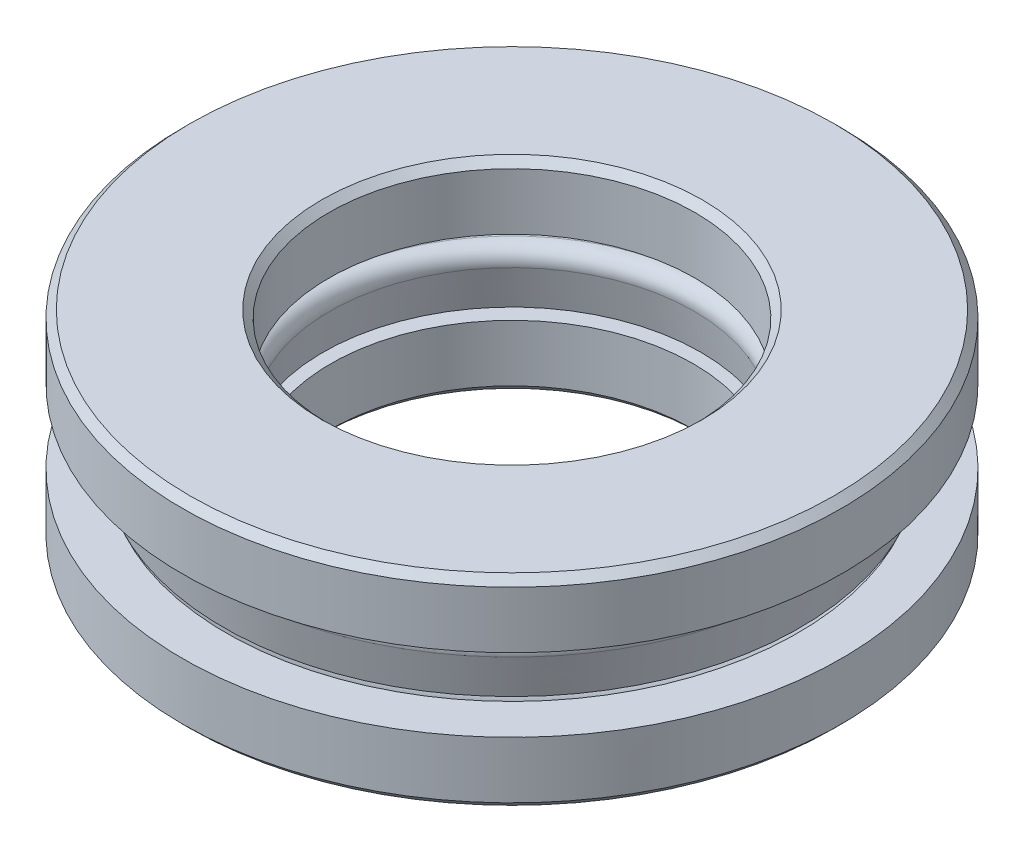
ISO-10303-21;
HEADER;
FILE_DESCRIPTION(('STEP AP214'),'2;1');
FILE_NAME('part.step','',(''),(''),'','','');
FILE_SCHEMA(('AUTOMOTIVE_DESIGN { 1 0 10303 214 1 1 1 1 }'));
ENDSEC;
DATA;
#1=APPLICATION_CONTEXT('core data for automotive mechanical design processes');
#2=APPLICATION_PROTOCOL_DEFINITION('international standard','automotive_design',2000,#1);
#3=PRODUCT_CONTEXT('',#1,'mechanical');
#4=PRODUCT('Part','Part','',(#3));
#5=PRODUCT_RELATED_PRODUCT_CATEGORY('part','',(#4));
#6=PRODUCT_DEFINITION_FORMATION('','',#4);
#7=PRODUCT_DEFINITION_CONTEXT('part definition',#1,'design');
#8=PRODUCT_DEFINITION('design','',#6,#7);
#9=PRODUCT_DEFINITION_SHAPE('','',#8);
#10=(LENGTH_UNIT() NAMED_UNIT(*) SI_UNIT(.MILLI.,.METRE.));
#11=(NAMED_UNIT(*) PLANE_ANGLE_UNIT() SI_UNIT($,.RADIAN.));
#12=(NAMED_UNIT(*) SI_UNIT($,.STERADIAN.) SOLID_ANGLE_UNIT());
#13=UNCERTAINTY_MEASURE_WITH_UNIT(LENGTH_MEASURE(1.E-05),#10,'distance_accuracy_value','');
#14=(GEOMETRIC_REPRESENTATION_CONTEXT(3) GLOBAL_UNCERTAINTY_ASSIGNED_CONTEXT((#13)) GLOBAL_UNIT_ASSIGNED_CONTEXT((#10,
#11,#12)) REPRESENTATION_CONTEXT('',''));
#15=CARTESIAN_POINT('',(0.,0.,0.));
#16=DIRECTION('',(0.,0.,1.));
#17=DIRECTION('',(1.,0.,0.));
#18=AXIS2_PLACEMENT_3D('',#15,#16,#17);
#19=CARTESIAN_POINT('',(0.,-0.834729635533447,0.));
#20=DIRECTION('',(0.,-1.,0.));
#21=DIRECTION('',(0.,0.,-1.));
#22=AXIS2_PLACEMENT_3D('',#19,#20,#21);
#23=CONICAL_SURFACE('',#22,7.87064602924939,1.39626340159545);
#24=CARTESIAN_POINT('',(0.,-0.800000000000058,0.));
#25=DIRECTION('',(0.,-1.,0.));
#26=DIRECTION('',(0.,0.,-1.));
#27=AXIS2_PLACEMENT_3D('',#24,#25,#26);
#28=CIRCLE('',#27,7.67368447864695);
#29=CARTESIAN_POINT('',(0.,-0.80000000000012,-7.67368447864692));
#30=VERTEX_POINT('',#29);
#31=EDGE_CURVE('E84',#30,#30,#28,.T.);
#32=ORIENTED_EDGE('',*,*,#31,.F.);
#33=EDGE_LOOP('',(#32));
#34=FACE_BOUND('',#33,.T.);
#35=CARTESIAN_POINT('',(0.,-0.834729635533447,0.));
#36=DIRECTION('',(0.,-1.,0.));
#37=DIRECTION('',(0.,0.,-1.));
#38=AXIS2_PLACEMENT_3D('',#35,#36,#37);
#39=CIRCLE('',#38,7.87064602924939);
#40=CARTESIAN_POINT('',(0.,-0.83472963553351,-7.87064602924936));
#41=VERTEX_POINT('',#40);
#42=EDGE_CURVE('E11',#41,#41,#39,.T.);
#43=ORIENTED_EDGE('',*,*,#42,.T.);
#44=EDGE_LOOP('',(#43));
#45=FACE_BOUND('',#44,.T.);
#46=ADVANCED_FACE('F44',(#34,#45),#23,.F.);
#47=CARTESIAN_POINT('',(0.,0.230540728933161,0.));
#48=DIRECTION('',(0.,1.,0.));
#49=DIRECTION('',(0.,0.,1.));
#50=AXIS2_PLACEMENT_3D('',#47,#48,#49);
#51=CONICAL_SURFACE('',#50,8.05848193625401,0.174532925199447);
#52=ORIENTED_EDGE('',*,*,#42,.F.);
#53=EDGE_LOOP('',(#52));
#54=FACE_BOUND('',#53,.T.);
#55=CARTESIAN_POINT('',(0.,0.230540728933161,0.));
#56=DIRECTION('',(0.,-1.,0.));
#57=DIRECTION('',(0.,0.,-1.));
#58=AXIS2_PLACEMENT_3D('',#55,#56,#57);
#59=CIRCLE('',#58,8.05848193625401);
#60=CARTESIAN_POINT('',(0.,0.230540728933097,-8.05848193625399));
#61=VERTEX_POINT('',#60);
#62=EDGE_CURVE('E50',#61,#61,#59,.T.);
#63=ORIENTED_EDGE('',*,*,#62,.T.);
#64=EDGE_LOOP('',(#63));
#65=FACE_BOUND('',#64,.T.);
#66=ADVANCED_FACE('F91',(#54,#65),#51,.T.);
#67=CARTESIAN_POINT('',(0.,0.299999999999938,0.));
#68=DIRECTION('',(0.,-1.,0.));
#69=DIRECTION('',(0.,0.,-1.));
#70=AXIS2_PLACEMENT_3D('',#67,#68,#69);
#71=TOROIDAL_SURFACE('',#70,7.66455883504913,0.4);
#72=ORIENTED_EDGE('',*,*,#62,.F.);
#73=EDGE_LOOP('',(#72));
#74=FACE_BOUND('',#73,.T.);
#75=CARTESIAN_POINT('',(0.,0.699999999999938,0.));
#76=DIRECTION('',(0.,-1.,0.));
#77=DIRECTION('',(0.,0.,-1.));
#78=AXIS2_PLACEMENT_3D('',#75,#76,#77);
#79=CIRCLE('',#78,7.66455883504913);
#80=CARTESIAN_POINT('',(0.,0.699999999999877,-7.66455883504911));
#81=VERTEX_POINT('',#80);
#82=EDGE_CURVE('E54',#81,#81,#79,.T.);
#83=ORIENTED_EDGE('',*,*,#82,.T.);
#84=EDGE_LOOP('',(#83));
#85=FACE_BOUND('',#84,.T.);
#86=ADVANCED_FACE('F95',(#74,#85),#71,.T.);
#87=CARTESIAN_POINT('',(0.,0.700000000000008,7.66455883504915));
#88=DIRECTION('',(0.,-1.,0.));
#89=DIRECTION('',(0.,0.,-1.));
#90=AXIS2_PLACEMENT_3D('',#87,#88,#89);
#91=PLANE('',#90);
#92=ORIENTED_EDGE('',*,*,#82,.F.);
#93=EDGE_LOOP('',(#92));
#94=FACE_BOUND('',#93,.T.);
#95=CARTESIAN_POINT('',(0.,0.699999999999957,0.));
#96=DIRECTION('',(0.,-1.,0.));
#97=DIRECTION('',(0.,0.,-1.));
#98=AXIS2_PLACEMENT_3D('',#95,#96,#97);
#99=CIRCLE('',#98,5.36544116495084);
#100=CARTESIAN_POINT('',(0.,0.699999999999914,-5.36544116495082));
#101=VERTEX_POINT('',#100);
#102=EDGE_CURVE('E58',#101,#101,#99,.T.);
#103=ORIENTED_EDGE('',*,*,#102,.T.);
#104=EDGE_LOOP('',(#103));
#105=FACE_BOUND('',#104,.T.);
#106=ADVANCED_FACE('F100',(#94,#105),#91,.F.);
#107=CARTESIAN_POINT('',(0.,0.299999999999957,0.));
#108=DIRECTION('',(0.,-1.,0.));
#109=DIRECTION('',(0.,0.,-1.));
#110=AXIS2_PLACEMENT_3D('',#107,#108,#109);
#111=TOROIDAL_SURFACE('',#110,5.36544116495083,0.4);
#112=ORIENTED_EDGE('',*,*,#102,.F.);
#113=EDGE_LOOP('',(#112));
#114=FACE_BOUND('',#113,.T.);
#115=CARTESIAN_POINT('',(0.,0.230540728933186,0.));
#116=DIRECTION('',(0.,-1.,0.));
#117=DIRECTION('',(0.,0.,-1.));
#118=AXIS2_PLACEMENT_3D('',#115,#116,#117);
#119=CIRCLE('',#118,4.97151806374595);
#120=CARTESIAN_POINT('',(0.,0.230540728933146,-4.97151806374593));
#121=VERTEX_POINT('',#120);
#122=EDGE_CURVE('E63',#121,#121,#119,.T.);
#123=ORIENTED_EDGE('',*,*,#122,.T.);
#124=EDGE_LOOP('',(#123));
#125=FACE_BOUND('',#124,.T.);
#126=ADVANCED_FACE('F106',(#114,#125),#111,.T.);
#127=CARTESIAN_POINT('',(0.,-0.834729635533425,0.));
#128=DIRECTION('',(0.,-1.,0.));
#129=DIRECTION('',(0.,0.,-1.));
#130=AXIS2_PLACEMENT_3D('',#127,#128,#129);
#131=CONICAL_SURFACE('',#130,5.15935397075055,0.17453292519943);
#132=ORIENTED_EDGE('',*,*,#122,.F.);
#133=EDGE_LOOP('',(#132));
#134=FACE_BOUND('',#133,.T.);
#135=CARTESIAN_POINT('',(0.,-0.834729635533425,0.));
#136=DIRECTION('',(0.,-1.,0.));
#137=DIRECTION('',(0.,0.,-1.));
#138=AXIS2_PLACEMENT_3D('',#135,#136,#137);
#139=CIRCLE('',#138,5.15935397075055);
#140=CARTESIAN_POINT('',(0.,-0.834729635533466,-5.15935397075052));
#141=VERTEX_POINT('',#140);
#142=EDGE_CURVE('E66',#141,#141,#139,.T.);
#143=ORIENTED_EDGE('',*,*,#142,.T.);
#144=EDGE_LOOP('',(#143));
#145=FACE_BOUND('',#144,.T.);
#146=ADVANCED_FACE('F110',(#134,#145),#131,.F.);
#147=CARTESIAN_POINT('',(0.,-0.80000000000004,0.));
#148=DIRECTION('',(0.,1.,0.));
#149=DIRECTION('',(0.,0.,1.));
#150=AXIS2_PLACEMENT_3D('',#147,#148,#149);
#151=CONICAL_SURFACE('',#150,5.35631552135299,1.39626340159547);
#152=ORIENTED_EDGE('',*,*,#142,.F.);
#153=EDGE_LOOP('',(#152));
#154=FACE_BOUND('',#153,.T.);
#155=CARTESIAN_POINT('',(0.,-0.80000000000004,0.));
#156=DIRECTION('',(0.,-1.,0.));
#157=DIRECTION('',(0.,0.,-1.));
#158=AXIS2_PLACEMENT_3D('',#155,#156,#157);
#159=CIRCLE('',#158,5.35631552135299);
#160=CARTESIAN_POINT('',(0.,-0.800000000000082,-5.35631552135296));
#161=VERTEX_POINT('',#160);
#162=EDGE_CURVE('E69',#161,#161,#159,.T.);
#163=ORIENTED_EDGE('',*,*,#162,.T.);
#164=EDGE_LOOP('',(#163));
#165=FACE_BOUND('',#164,.T.);
#166=ADVANCED_FACE('F114',(#154,#165),#151,.T.);
#167=CARTESIAN_POINT('',(0.,0.265270364466571,0.));
#168=DIRECTION('',(0.,-1.,0.));
#169=DIRECTION('',(0.,0.,-1.));
#170=AXIS2_PLACEMENT_3D('',#167,#168,#169);
#171=CONICAL_SURFACE('',#170,5.16847961434839,0.174532925199428);
#172=ORIENTED_EDGE('',*,*,#162,.F.);
#173=EDGE_LOOP('',(#172));
#174=FACE_BOUND('',#173,.T.);
#175=CARTESIAN_POINT('',(0.,0.265270364466571,0.));
#176=DIRECTION('',(0.,-1.,0.));
#177=DIRECTION('',(0.,0.,-1.));
#178=AXIS2_PLACEMENT_3D('',#175,#176,#177);
#179=CIRCLE('',#178,5.16847961434839);
#180=CARTESIAN_POINT('',(0.,0.26527036446653,-5.16847961434837));
#181=VERTEX_POINT('',#180);
#182=EDGE_CURVE('E72',#181,#181,#179,.T.);
#183=ORIENTED_EDGE('',*,*,#182,.T.);
#184=EDGE_LOOP('',(#183));
#185=FACE_BOUND('',#184,.T.);
#186=ADVANCED_FACE('F118',(#174,#185),#171,.T.);
#187=CARTESIAN_POINT('',(0.,0.299999999999957,0.));
#188=DIRECTION('',(0.,-1.,0.));
#189=DIRECTION('',(0.,0.,-1.));
#190=AXIS2_PLACEMENT_3D('',#187,#188,#189);
#191=TOROIDAL_SURFACE('',#190,5.36544116495083,0.2);
#192=ORIENTED_EDGE('',*,*,#182,.F.);
#193=EDGE_LOOP('',(#192));
#194=FACE_BOUND('',#193,.T.);
#195=CARTESIAN_POINT('',(0.,0.499999999999957,0.));
#196=DIRECTION('',(0.,-1.,0.));
#197=DIRECTION('',(0.,0.,-1.));
#198=AXIS2_PLACEMENT_3D('',#195,#196,#197);
#199=CIRCLE('',#198,5.36544116495083);
#200=CARTESIAN_POINT('',(0.,0.499999999999914,-5.36544116495081));
#201=VERTEX_POINT('',#200);
#202=EDGE_CURVE('E75',#201,#201,#199,.T.);
#203=ORIENTED_EDGE('',*,*,#202,.T.);
#204=EDGE_LOOP('',(#203));
#205=FACE_BOUND('',#204,.T.);
#206=ADVANCED_FACE('F122',(#194,#205),#191,.F.);
#207=CARTESIAN_POINT('',(0.,0.49999999999999,5.36544116495085));
#208=DIRECTION('',(0.,1.,0.));
#209=DIRECTION('',(0.,0.,1.));
#210=AXIS2_PLACEMENT_3D('',#207,#208,#209);
#211=PLANE('',#210);
#212=ORIENTED_EDGE('',*,*,#202,.F.);
#213=EDGE_LOOP('',(#212));
#214=FACE_BOUND('',#213,.T.);
#215=CARTESIAN_POINT('',(0.,0.499999999999937,0.));
#216=DIRECTION('',(0.,-1.,0.));
#217=DIRECTION('',(0.,0.,-1.));
#218=AXIS2_PLACEMENT_3D('',#215,#216,#217);
#219=CIRCLE('',#218,7.66455883504913);
#220=CARTESIAN_POINT('',(0.,0.499999999999876,-7.66455883504911));
#221=VERTEX_POINT('',#220);
#222=EDGE_CURVE('E78',#221,#221,#219,.T.);
#223=ORIENTED_EDGE('',*,*,#222,.T.);
#224=EDGE_LOOP('',(#223));
#225=FACE_BOUND('',#224,.T.);
#226=ADVANCED_FACE('F126',(#214,#225),#211,.F.);
#227=CARTESIAN_POINT('',(0.,0.299999999999938,0.));
#228=DIRECTION('',(0.,-1.,0.));
#229=DIRECTION('',(0.,0.,-1.));
#230=AXIS2_PLACEMENT_3D('',#227,#228,#229);
#231=TOROIDAL_SURFACE('',#230,7.66455883504913,0.199999999999999);
#232=ORIENTED_EDGE('',*,*,#222,.F.);
#233=EDGE_LOOP('',(#232));
#234=FACE_BOUND('',#233,.T.);
#235=CARTESIAN_POINT('',(0.,0.26527036446655,0.));
#236=DIRECTION('',(0.,-1.,0.));
#237=DIRECTION('',(0.,0.,-1.));
#238=AXIS2_PLACEMENT_3D('',#235,#236,#237);
#239=CIRCLE('',#238,7.86152038565157);
#240=CARTESIAN_POINT('',(0.,0.265270364466487,-7.86152038565155));
#241=VERTEX_POINT('',#240);
#242=EDGE_CURVE('E81',#241,#241,#239,.T.);
#243=ORIENTED_EDGE('',*,*,#242,.T.);
#244=EDGE_LOOP('',(#243));
#245=FACE_BOUND('',#244,.T.);
#246=ADVANCED_FACE('F130',(#234,#245),#231,.F.);
#247=CARTESIAN_POINT('',(0.,-0.800000000000058,0.));
#248=DIRECTION('',(0.,1.,0.));
#249=DIRECTION('',(0.,0.,1.));
#250=AXIS2_PLACEMENT_3D('',#247,#248,#249);
#251=CONICAL_SURFACE('',#250,7.67368447864695,0.174532925199444);
#252=ORIENTED_EDGE('',*,*,#242,.F.);
#253=EDGE_LOOP('',(#252));
#254=FACE_BOUND('',#253,.T.);
#255=ORIENTED_EDGE('',*,*,#31,.T.);
#256=EDGE_LOOP('',(#255));
#257=FACE_BOUND('',#256,.T.);
#258=ADVANCED_FACE('F88',(#254,#257),#251,.F.);
#259=CLOSED_SHELL('',(#46,#66,#86,#106,#126,#146,#166,#186,#206,#226,#246,#258));
#260=MANIFOLD_SOLID_BREP('B2',#259);
#261=CARTESIAN_POINT('',(-4.6068006794303,0.,-4.60680067943041));
#262=DIRECTION('',(-0.707106781186539,0.,-0.707106781186556));
#263=DIRECTION('',(0.707106781186556,0.,-0.707106781186539));
#264=AXIS2_PLACEMENT_3D('',#261,#262,#263);
#265=SPHERICAL_SURFACE('',#264,1.28);
#266=CARTESIAN_POINT('',(-5.51189735934907,0.,-5.5118973593492));
#267=VERTEX_POINT('',#266);
#268=VERTEX_LOOP('',#267);
#269=FACE_BOUND('',#268,.T.);
#270=ADVANCED_FACE('F232',(#269),#265,.T.);
#271=CLOSED_SHELL('',(#270));
#272=MANIFOLD_SOLID_BREP('B6',#271);
#273=CARTESIAN_POINT('',(-6.515,0.,0.));
#274=DIRECTION('',(-1.,0.,0.));
#275=DIRECTION('',(0.,0.,-1.));
#276=AXIS2_PLACEMENT_3D('',#273,#274,#275);
#277=SPHERICAL_SURFACE('',#276,1.28);
#278=CARTESIAN_POINT('',(-7.795,0.,0.));
#279=VERTEX_POINT('',#278);
#280=VERTEX_LOOP('',#279);
#281=FACE_BOUND('',#280,.T.);
#282=ADVANCED_FACE('F253',(#281),#277,.T.);
#283=CLOSED_SHELL('',(#282));
#284=MANIFOLD_SOLID_BREP('B40',#283);
#285=CARTESIAN_POINT('',(-4.6068006794304,0.,4.60680067943032));
#286=DIRECTION('',(-0.707106781186554,0.,0.707106781186541));
#287=DIRECTION('',(-0.707106781186541,0.,-0.707106781186554));
#288=AXIS2_PLACEMENT_3D('',#285,#286,#287);
#289=SPHERICAL_SURFACE('',#288,1.28);
#290=CARTESIAN_POINT('',(-5.51189735934919,0.,5.51189735934909));
#291=VERTEX_POINT('',#290);
#292=VERTEX_LOOP('',#291);
#293=FACE_BOUND('',#292,.T.);
#294=ADVANCED_FACE('F274',(#293),#289,.T.);
#295=CLOSED_SHELL('',(#294));
#296=MANIFOLD_SOLID_BREP('B228',#295);
#297=CARTESIAN_POINT('',(0.,0.,6.515));
#298=DIRECTION('',(0.,0.,1.));
#299=DIRECTION('',(-1.,0.,0.));
#300=AXIS2_PLACEMENT_3D('',#297,#298,#299);
#301=SPHERICAL_SURFACE('',#300,1.28);
#302=CARTESIAN_POINT('',(0.,0.,7.795));
#303=VERTEX_POINT('',#302);
#304=VERTEX_LOOP('',#303);
#305=FACE_BOUND('',#304,.T.);
#306=ADVANCED_FACE('F295',(#305),#301,.T.);
#307=CLOSED_SHELL('',(#306));
#308=MANIFOLD_SOLID_BREP('B249',#307);
#309=CARTESIAN_POINT('',(4.60680067943033,0.,4.60680067943038));
#310=DIRECTION('',(0.707106781186544,0.,0.707106781186551));
#311=DIRECTION('',(-0.707106781186551,0.,0.707106781186544));
#312=AXIS2_PLACEMENT_3D('',#309,#310,#311);
#313=SPHERICAL_SURFACE('',#312,1.28);
#314=CARTESIAN_POINT('',(5.51189735934911,0.,5.51189735934917));
#315=VERTEX_POINT('',#314);
#316=VERTEX_LOOP('',#315);
#317=FACE_BOUND('',#316,.T.);
#318=ADVANCED_FACE('F316',(#317),#313,.T.);
#319=CLOSED_SHELL('',(#318));
#320=MANIFOLD_SOLID_BREP('B270',#319);
#321=CARTESIAN_POINT('',(6.515,0.,0.));
#322=DIRECTION('',(1.,0.,0.));
#323=DIRECTION('',(0.,0.,1.));
#324=AXIS2_PLACEMENT_3D('',#321,#322,#323);
#325=SPHERICAL_SURFACE('',#324,1.28);
#326=CARTESIAN_POINT('',(7.795,0.,0.));
#327=VERTEX_POINT('',#326);
#328=VERTEX_LOOP('',#327);
#329=FACE_BOUND('',#328,.T.);
#330=ADVANCED_FACE('F337',(#329),#325,.T.);
#331=CLOSED_SHELL('',(#330));
#332=MANIFOLD_SOLID_BREP('B291',#331);
#333=CARTESIAN_POINT('',(4.60680067943037,0.,-4.60680067943035));
#334=DIRECTION('',(0.707106781186549,0.,-0.707106781186546));
#335=DIRECTION('',(0.707106781186546,0.,0.707106781186549));
#336=AXIS2_PLACEMENT_3D('',#333,#334,#335);
#337=SPHERICAL_SURFACE('',#336,1.28);
#338=CARTESIAN_POINT('',(5.51189735934915,0.,-5.51189735934913));
#339=VERTEX_POINT('',#338);
#340=VERTEX_LOOP('',#339);
#341=FACE_BOUND('',#340,.T.);
#342=ADVANCED_FACE('F358',(#341),#337,.T.);
#343=CLOSED_SHELL('',(#342));
#344=MANIFOLD_SOLID_BREP('B312',#343);
#345=CARTESIAN_POINT('',(0.,0.,-6.515));
#346=DIRECTION('',(0.,0.,-1.));
#347=DIRECTION('',(1.,0.,0.));
#348=AXIS2_PLACEMENT_3D('',#345,#346,#347);
#349=SPHERICAL_SURFACE('',#348,1.28);
#350=CARTESIAN_POINT('',(0.,0.,-7.795));
#351=VERTEX_POINT('',#350);
#352=VERTEX_LOOP('',#351);
#353=FACE_BOUND('',#352,.T.);
#354=ADVANCED_FACE('F381',(#353),#349,.T.);
#355=CLOSED_SHELL('',(#354));
#356=MANIFOLD_SOLID_BREP('B333',#355);
#357=CARTESIAN_POINT('',(0.,-2.75000000000001,4.95));
#358=DIRECTION('',(0.,1.,0.));
#359=DIRECTION('',(0.,0.,1.));
#360=AXIS2_PLACEMENT_3D('',#357,#358,#359);
#361=PLANE('',#360);
#362=CARTESIAN_POINT('',(0.,-2.75000000000001,0.));
#363=DIRECTION('',(0.,1.,0.));
#364=DIRECTION('',(0.,0.,1.));
#365=AXIS2_PLACEMENT_3D('',#362,#363,#364);
#366=CIRCLE('',#365,8.8);
#367=CARTESIAN_POINT('',(0.,-2.75000000000001,8.8));
#368=VERTEX_POINT('',#367);
#369=EDGE_CURVE('E413',#368,#368,#366,.F.);
#370=ORIENTED_EDGE('',*,*,#369,.T.);
#371=EDGE_LOOP('',(#370));
#372=FACE_BOUND('',#371,.T.);
#373=CARTESIAN_POINT('',(0.,-2.75000000000001,0.));
#374=DIRECTION('',(0.,1.,0.));
#375=DIRECTION('',(0.,0.,1.));
#376=AXIS2_PLACEMENT_3D('',#373,#374,#375);
#377=CIRCLE('',#376,5.15);
#378=CARTESIAN_POINT('',(0.,-2.75000000000001,5.15));
#379=VERTEX_POINT('',#378);
#380=EDGE_CURVE('E417',#379,#379,#377,.T.);
#381=ORIENTED_EDGE('',*,*,#380,.T.);
#382=EDGE_LOOP('',(#381));
#383=FACE_BOUND('',#382,.T.);
#384=ADVANCED_FACE('F401',(#372,#383),#361,.F.);
#385=CARTESIAN_POINT('',(0.,-2.74999999999999,0.));
#386=DIRECTION('',(0.,-1.,0.));
#387=DIRECTION('',(0.,0.,-1.));
#388=AXIS2_PLACEMENT_3D('',#385,#386,#387);
#389=CYLINDRICAL_SURFACE('',#388,9.);
#390=CARTESIAN_POINT('',(0.,-2.55000000000001,0.));
#391=DIRECTION('',(0.,1.,0.));
#392=DIRECTION('',(0.,0.,1.));
#393=AXIS2_PLACEMENT_3D('',#390,#391,#392);
#394=CIRCLE('',#393,9.);
#395=CARTESIAN_POINT('',(0.,-2.55000000000001,9.));
#396=VERTEX_POINT('',#395);
#397=EDGE_CURVE('E409',#396,#396,#394,.T.);
#398=ORIENTED_EDGE('',*,*,#397,.T.);
#399=EDGE_LOOP('',(#398));
#400=FACE_BOUND('',#399,.T.);
#401=CARTESIAN_POINT('',(0.,-1.,0.));
#402=DIRECTION('',(0.,-1.,0.));
#403=DIRECTION('',(0.,0.,-1.));
#404=AXIS2_PLACEMENT_3D('',#401,#402,#403);
#405=CIRCLE('',#404,9.);
#406=CARTESIAN_POINT('',(0.,-0.999999999999999,-9.));
#407=VERTEX_POINT('',#406);
#408=EDGE_CURVE('E422',#407,#407,#405,.T.);
#409=ORIENTED_EDGE('',*,*,#408,.T.);
#410=EDGE_LOOP('',(#409));
#411=FACE_BOUND('',#410,.T.);
#412=ADVANCED_FACE('F450',(#400,#411),#389,.T.);
#413=CARTESIAN_POINT('',(0.,-1.,9.));
#414=DIRECTION('',(0.,-1.,0.));
#415=DIRECTION('',(0.,0.,-1.));
#416=AXIS2_PLACEMENT_3D('',#413,#414,#415);
#417=PLANE('',#416);
#418=ORIENTED_EDGE('',*,*,#408,.F.);
#419=EDGE_LOOP('',(#418));
#420=FACE_BOUND('',#419,.T.);
#421=CARTESIAN_POINT('',(0.,-1.,0.));
#422=DIRECTION('',(0.,-1.,0.));
#423=DIRECTION('',(0.,0.,-1.));
#424=AXIS2_PLACEMENT_3D('',#421,#422,#423);
#425=CIRCLE('',#424,7.8);
#426=CARTESIAN_POINT('',(0.,-1.,-7.8));
#427=VERTEX_POINT('',#426);
#428=EDGE_CURVE('E425',#427,#427,#425,.T.);
#429=ORIENTED_EDGE('',*,*,#428,.T.);
#430=EDGE_LOOP('',(#429));
#431=FACE_BOUND('',#430,.T.);
#432=ADVANCED_FACE('F456',(#420,#431),#417,.F.);
#433=CARTESIAN_POINT('',(0.,1.21979728804231,0.));
#434=DIRECTION('',(0.,-1.,0.));
#435=DIRECTION('',(0.,0.,-1.));
#436=AXIS2_PLACEMENT_3D('',#433,#434,#435);
#437=TOROIDAL_SURFACE('',#436,6.65,2.5);
#438=ORIENTED_EDGE('',*,*,#428,.F.);
#439=EDGE_LOOP('',(#438));
#440=FACE_BOUND('',#439,.T.);
#441=CARTESIAN_POINT('',(0.,-1.,0.));
#442=DIRECTION('',(0.,-1.,0.));
#443=DIRECTION('',(0.,0.,-1.));
#444=AXIS2_PLACEMENT_3D('',#441,#442,#443);
#445=CIRCLE('',#444,5.5);
#446=CARTESIAN_POINT('',(0.,-1.,-5.5));
#447=VERTEX_POINT('',#446);
#448=EDGE_CURVE('E428',#447,#447,#445,.T.);
#449=ORIENTED_EDGE('',*,*,#448,.T.);
#450=EDGE_LOOP('',(#449));
#451=FACE_BOUND('',#450,.T.);
#452=ADVANCED_FACE('F446',(#440,#451),#437,.F.);
#453=CARTESIAN_POINT('',(0.,-1.,4.95));
#454=DIRECTION('',(0.,-1.,0.));
#455=DIRECTION('',(0.,0.,-1.));
#456=AXIS2_PLACEMENT_3D('',#453,#454,#455);
#457=PLANE('',#456);
#458=ORIENTED_EDGE('',*,*,#448,.F.);
#459=EDGE_LOOP('',(#458));
#460=FACE_BOUND('',#459,.T.);
#461=CARTESIAN_POINT('',(0.,-1.,0.));
#462=DIRECTION('',(0.,-1.,0.));
#463=DIRECTION('',(0.,0.,-1.));
#464=AXIS2_PLACEMENT_3D('',#461,#462,#463);
#465=CIRCLE('',#464,4.95);
#466=CARTESIAN_POINT('',(0.,-1.,-4.95));
#467=VERTEX_POINT('',#466);
#468=EDGE_CURVE('E431',#467,#467,#465,.T.);
#469=ORIENTED_EDGE('',*,*,#468,.T.);
#470=EDGE_LOOP('',(#469));
#471=FACE_BOUND('',#470,.T.);
#472=ADVANCED_FACE('F435',(#460,#471),#457,.F.);
#473=CARTESIAN_POINT('',(0.,-2.74999999999999,0.));
#474=DIRECTION('',(0.,-1.,0.));
#475=DIRECTION('',(0.,0.,-1.));
#476=AXIS2_PLACEMENT_3D('',#473,#474,#475);
#477=CYLINDRICAL_SURFACE('',#476,4.95);
#478=CARTESIAN_POINT('',(0.,-2.55000000000001,0.));
#479=DIRECTION('',(0.,1.,0.));
#480=DIRECTION('',(0.,0.,1.));
#481=AXIS2_PLACEMENT_3D('',#478,#479,#480);
#482=CIRCLE('',#481,4.95);
#483=CARTESIAN_POINT('',(0.,-2.55000000000002,4.95));
#484=VERTEX_POINT('',#483);
#485=EDGE_CURVE('E380',#484,#484,#482,.F.);
#486=ORIENTED_EDGE('',*,*,#485,.T.);
#487=EDGE_LOOP('',(#486));
#488=FACE_BOUND('',#487,.T.);
#489=ORIENTED_EDGE('',*,*,#468,.F.);
#490=EDGE_LOOP('',(#489));
#491=FACE_BOUND('',#490,.T.);
#492=ADVANCED_FACE('F437',(#488,#491),#477,.F.);
#493=CARTESIAN_POINT('',(0.,-2.75000000000001,0.));
#494=DIRECTION('',(0.,1.,0.));
#495=DIRECTION('',(0.,0.,1.));
#496=AXIS2_PLACEMENT_3D('',#493,#494,#495);
#497=CONICAL_SURFACE('',#496,8.8,0.785398163397448);
#498=ORIENTED_EDGE('',*,*,#397,.F.);
#499=EDGE_LOOP('',(#498));
#500=FACE_BOUND('',#499,.T.);
#501=ORIENTED_EDGE('',*,*,#369,.F.);
#502=EDGE_LOOP('',(#501));
#503=FACE_BOUND('',#502,.T.);
#504=ADVANCED_FACE('F439',(#500,#503),#497,.T.);
#505=CARTESIAN_POINT('',(0.,-2.55000000000001,0.));
#506=DIRECTION('',(0.,-1.,0.));
#507=DIRECTION('',(0.,0.,-1.));
#508=AXIS2_PLACEMENT_3D('',#505,#506,#507);
#509=CONICAL_SURFACE('',#508,4.95,0.785398163397459);
#510=ORIENTED_EDGE('',*,*,#380,.F.);
#511=EDGE_LOOP('',(#510));
#512=FACE_BOUND('',#511,.T.);
#513=ORIENTED_EDGE('',*,*,#485,.F.);
#514=EDGE_LOOP('',(#513));
#515=FACE_BOUND('',#514,.T.);
#516=ADVANCED_FACE('F404',(#512,#515),#509,.F.);
#517=CLOSED_SHELL('',(#384,#412,#432,#452,#472,#492,#504,#516));
#518=MANIFOLD_SOLID_BREP('B354',#517);
#519=CARTESIAN_POINT('',(0.,-2.74999999999999,0.));
#520=DIRECTION('',(0.,-1.,0.));
#521=DIRECTION('',(0.,0.,-1.));
#522=AXIS2_PLACEMENT_3D('',#519,#520,#521);
#523=CYLINDRICAL_SURFACE('',#522,5.);
#524=CARTESIAN_POINT('',(0.,2.55,0.));
#525=DIRECTION('',(0.,-1.,0.));
#526=DIRECTION('',(0.,0.,-1.));
#527=AXIS2_PLACEMENT_3D('',#524,#525,#526);
#528=CIRCLE('',#527,5.);
#529=CARTESIAN_POINT('',(0.,2.55,-5.));
#530=VERTEX_POINT('',#529);
#531=EDGE_CURVE('E400',#530,#530,#528,.F.);
#532=ORIENTED_EDGE('',*,*,#531,.T.);
#533=EDGE_LOOP('',(#532));
#534=FACE_BOUND('',#533,.T.);
#535=CARTESIAN_POINT('',(0.,0.999999999999999,0.));
#536=DIRECTION('',(0.,-1.,0.));
#537=DIRECTION('',(0.,0.,-1.));
#538=AXIS2_PLACEMENT_3D('',#535,#536,#537);
#539=CIRCLE('',#538,5.);
#540=CARTESIAN_POINT('',(0.,1.,-5.));
#541=VERTEX_POINT('',#540);
#542=EDGE_CURVE('E559',#541,#541,#539,.T.);
#543=ORIENTED_EDGE('',*,*,#542,.T.);
#544=EDGE_LOOP('',(#543));
#545=FACE_BOUND('',#544,.T.);
#546=ADVANCED_FACE('F529',(#534,#545),#523,.F.);
#547=CARTESIAN_POINT('',(0.,2.74999999999999,5.));
#548=DIRECTION('',(0.,-1.,0.));
#549=DIRECTION('',(0.,0.,-1.));
#550=AXIS2_PLACEMENT_3D('',#547,#548,#549);
#551=PLANE('',#550);
#552=CARTESIAN_POINT('',(0.,2.74999999999999,0.));
#553=DIRECTION('',(0.,-1.,0.));
#554=DIRECTION('',(0.,0.,-1.));
#555=AXIS2_PLACEMENT_3D('',#552,#553,#554);
#556=CIRCLE('',#555,8.8);
#557=CARTESIAN_POINT('',(0.,2.75,-8.8));
#558=VERTEX_POINT('',#557);
#559=EDGE_CURVE('E537',#558,#558,#556,.F.);
#560=ORIENTED_EDGE('',*,*,#559,.T.);
#561=EDGE_LOOP('',(#560));
#562=FACE_BOUND('',#561,.T.);
#563=CARTESIAN_POINT('',(0.,2.74999999999999,0.));
#564=DIRECTION('',(0.,-1.,0.));
#565=DIRECTION('',(0.,0.,-1.));
#566=AXIS2_PLACEMENT_3D('',#563,#564,#565);
#567=CIRCLE('',#566,5.2);
#568=CARTESIAN_POINT('',(0.,2.74999999999999,-5.19999999999999));
#569=VERTEX_POINT('',#568);
#570=EDGE_CURVE('E541',#569,#569,#567,.T.);
#571=ORIENTED_EDGE('',*,*,#570,.T.);
#572=EDGE_LOOP('',(#571));
#573=FACE_BOUND('',#572,.T.);
#574=ADVANCED_FACE('F585',(#562,#573),#551,.F.);
#575=CARTESIAN_POINT('',(0.,-2.74999999999999,0.));
#576=DIRECTION('',(0.,-1.,0.));
#577=DIRECTION('',(0.,0.,-1.));
#578=AXIS2_PLACEMENT_3D('',#575,#576,#577);
#579=CYLINDRICAL_SURFACE('',#578,9.);
#580=CARTESIAN_POINT('',(0.,2.55,0.));
#581=DIRECTION('',(0.,-1.,0.));
#582=DIRECTION('',(0.,0.,-1.));
#583=AXIS2_PLACEMENT_3D('',#580,#581,#582);
#584=CIRCLE('',#583,9.);
#585=CARTESIAN_POINT('',(0.,2.55,-9.));
#586=VERTEX_POINT('',#585);
#587=EDGE_CURVE('E545',#586,#586,#584,.T.);
#588=ORIENTED_EDGE('',*,*,#587,.T.);
#589=EDGE_LOOP('',(#588));
#590=FACE_BOUND('',#589,.T.);
#591=CARTESIAN_POINT('',(0.,0.999999999999999,0.));
#592=DIRECTION('',(0.,-1.,0.));
#593=DIRECTION('',(0.,0.,-1.));
#594=AXIS2_PLACEMENT_3D('',#591,#592,#593);
#595=CIRCLE('',#594,9.);
#596=CARTESIAN_POINT('',(0.,1.,-9.));
#597=VERTEX_POINT('',#596);
#598=EDGE_CURVE('E550',#597,#597,#595,.T.);
#599=ORIENTED_EDGE('',*,*,#598,.F.);
#600=EDGE_LOOP('',(#599));
#601=FACE_BOUND('',#600,.T.);
#602=ADVANCED_FACE('F580',(#590,#601),#579,.T.);
#603=CARTESIAN_POINT('',(0.,0.999999999999997,9.));
#604=DIRECTION('',(0.,1.,0.));
#605=DIRECTION('',(0.,0.,1.));
#606=AXIS2_PLACEMENT_3D('',#603,#604,#605);
#607=PLANE('',#606);
#608=CARTESIAN_POINT('',(0.,0.999999999999999,0.));
#609=DIRECTION('',(0.,-1.,0.));
#610=DIRECTION('',(0.,0.,-1.));
#611=AXIS2_PLACEMENT_3D('',#608,#609,#610);
#612=CIRCLE('',#611,7.8);
#613=CARTESIAN_POINT('',(0.,1.,-7.8));
#614=VERTEX_POINT('',#613);
#615=EDGE_CURVE('E553',#614,#614,#612,.T.);
#616=ORIENTED_EDGE('',*,*,#615,.F.);
#617=EDGE_LOOP('',(#616));
#618=FACE_BOUND('',#617,.T.);
#619=ORIENTED_EDGE('',*,*,#598,.T.);
#620=EDGE_LOOP('',(#619));
#621=FACE_BOUND('',#620,.T.);
#622=ADVANCED_FACE('F574',(#618,#621),#607,.F.);
#623=CARTESIAN_POINT('',(0.,-1.21979728804231,0.));
#624=DIRECTION('',(0.,-1.,0.));
#625=DIRECTION('',(0.,0.,-1.));
#626=AXIS2_PLACEMENT_3D('',#623,#624,#625);
#627=TOROIDAL_SURFACE('',#626,6.65,2.5);
#628=CARTESIAN_POINT('',(0.,0.999999999999999,0.));
#629=DIRECTION('',(0.,-1.,0.));
#630=DIRECTION('',(0.,0.,-1.));
#631=AXIS2_PLACEMENT_3D('',#628,#629,#630);
#632=CIRCLE('',#631,5.5);
#633=CARTESIAN_POINT('',(0.,1.,-5.5));
#634=VERTEX_POINT('',#633);
#635=EDGE_CURVE('E556',#634,#634,#632,.T.);
#636=ORIENTED_EDGE('',*,*,#635,.F.);
#637=EDGE_LOOP('',(#636));
#638=FACE_BOUND('',#637,.T.);
#639=ORIENTED_EDGE('',*,*,#615,.T.);
#640=EDGE_LOOP('',(#639));
#641=FACE_BOUND('',#640,.T.);
#642=ADVANCED_FACE('F568',(#638,#641),#627,.F.);
#643=CARTESIAN_POINT('',(0.,0.999999999999998,5.));
#644=DIRECTION('',(0.,1.,0.));
#645=DIRECTION('',(0.,0.,1.));
#646=AXIS2_PLACEMENT_3D('',#643,#644,#645);
#647=PLANE('',#646);
#648=ORIENTED_EDGE('',*,*,#542,.F.);
#649=EDGE_LOOP('',(#648));
#650=FACE_BOUND('',#649,.T.);
#651=ORIENTED_EDGE('',*,*,#635,.T.);
#652=EDGE_LOOP('',(#651));
#653=FACE_BOUND('',#652,.T.);
#654=ADVANCED_FACE('F564',(#650,#653),#647,.F.);
#655=CARTESIAN_POINT('',(0.,2.55,0.));
#656=DIRECTION('',(0.,-1.,0.));
#657=DIRECTION('',(0.,0.,-1.));
#658=AXIS2_PLACEMENT_3D('',#655,#656,#657);
#659=CONICAL_SURFACE('',#658,9.,0.785398163397461);
#660=CARTESIAN_POINT('',(0.,2.75,-8.8));
#661=CARTESIAN_POINT('',(0.,2.74791666666666,-8.80208333333333));
#662=CARTESIAN_POINT('',(0.,2.74583333333333,-8.80416666666667));
#663=CARTESIAN_POINT('',(0.,2.74166666666666,-8.80833333333333));
#664=CARTESIAN_POINT('',(0.,2.73958333333333,-8.81041666666667));
#665=CARTESIAN_POINT('',(0.,2.73541666666666,-8.81458333333333));
#666=CARTESIAN_POINT('',(0.,2.73333333333333,-8.81666666666666));
#667=CARTESIAN_POINT('',(0.,2.72916666666666,-8.82083333333333));
#668=CARTESIAN_POINT('',(0.,2.72708333333333,-8.82291666666667));
#669=CARTESIAN_POINT('',(0.,2.72291666666666,-8.82708333333333));
#670=CARTESIAN_POINT('',(0.,2.72083333333333,-8.82916666666667));
#671=CARTESIAN_POINT('',(0.,2.71666666666666,-8.83333333333333));
#672=CARTESIAN_POINT('',(0.,2.71458333333333,-8.83541666666667));
#673=CARTESIAN_POINT('',(0.,2.71041666666666,-8.83958333333333));
#674=CARTESIAN_POINT('',(0.,2.70833333333333,-8.84166666666667));
#675=CARTESIAN_POINT('',(0.,2.70416666666666,-8.84583333333333));
#676=CARTESIAN_POINT('',(0.,2.70208333333333,-8.84791666666666));
#677=CARTESIAN_POINT('',(0.,2.69791666666666,-8.85208333333333));
#678=CARTESIAN_POINT('',(0.,2.69583333333333,-8.85416666666666));
#679=CARTESIAN_POINT('',(0.,2.69166666666666,-8.85833333333333));
#680=CARTESIAN_POINT('',(0.,2.68958333333333,-8.86041666666667));
#681=CARTESIAN_POINT('',(0.,2.68541666666666,-8.86458333333333));
#682=CARTESIAN_POINT('',(0.,2.68333333333333,-8.86666666666667));
#683=CARTESIAN_POINT('',(0.,2.67916666666666,-8.87083333333333));
#684=CARTESIAN_POINT('',(0.,2.67708333333333,-8.87291666666667));
#685=CARTESIAN_POINT('',(0.,2.67291666666666,-8.87708333333333));
#686=CARTESIAN_POINT('',(0.,2.67083333333333,-8.87916666666666));
#687=CARTESIAN_POINT('',(0.,2.66666666666666,-8.88333333333333));
#688=CARTESIAN_POINT('',(0.,2.66458333333333,-8.88541666666666));
#689=CARTESIAN_POINT('',(0.,2.66041666666667,-8.88958333333333));
#690=CARTESIAN_POINT('',(0.,2.65833333333333,-8.89166666666667));
#691=CARTESIAN_POINT('',(0.,2.65416666666667,-8.89583333333333));
#692=CARTESIAN_POINT('',(0.,2.65208333333333,-8.89791666666667));
#693=CARTESIAN_POINT('',(0.,2.64791666666666,-8.90208333333333));
#694=CARTESIAN_POINT('',(0.,2.64583333333333,-8.90416666666667));
#695=CARTESIAN_POINT('',(0.,2.64166666666667,-8.90833333333333));
#696=CARTESIAN_POINT('',(0.,2.63958333333333,-8.91041666666666));
#697=CARTESIAN_POINT('',(0.,2.63541666666667,-8.91458333333333));
#698=CARTESIAN_POINT('',(0.,2.63333333333333,-8.91666666666666));
#699=CARTESIAN_POINT('',(0.,2.62916666666667,-8.92083333333333));
#700=CARTESIAN_POINT('',(0.,2.62708333333333,-8.92291666666667));
#701=CARTESIAN_POINT('',(0.,2.62291666666667,-8.92708333333333));
#702=CARTESIAN_POINT('',(0.,2.62083333333333,-8.92916666666667));
#703=CARTESIAN_POINT('',(0.,2.61666666666667,-8.93333333333333));
#704=CARTESIAN_POINT('',(0.,2.61458333333333,-8.93541666666667));
#705=CARTESIAN_POINT('',(0.,2.61041666666667,-8.93958333333333));
#706=CARTESIAN_POINT('',(0.,2.60833333333333,-8.94166666666666));
#707=CARTESIAN_POINT('',(0.,2.60416666666667,-8.94583333333333));
#708=CARTESIAN_POINT('',(0.,2.60208333333333,-8.94791666666666));
#709=CARTESIAN_POINT('',(0.,2.59791666666667,-8.95208333333333));
#710=CARTESIAN_POINT('',(0.,2.59583333333333,-8.95416666666666));
#711=CARTESIAN_POINT('',(0.,2.59166666666667,-8.95833333333333));
#712=CARTESIAN_POINT('',(0.,2.58958333333333,-8.96041666666667));
#713=CARTESIAN_POINT('',(0.,2.58541666666667,-8.96458333333333));
#714=CARTESIAN_POINT('',(0.,2.58333333333333,-8.96666666666667));
#715=CARTESIAN_POINT('',(0.,2.57916666666667,-8.97083333333333));
#716=CARTESIAN_POINT('',(0.,2.57708333333333,-8.97291666666666));
#717=CARTESIAN_POINT('',(0.,2.57291666666667,-8.97708333333333));
#718=CARTESIAN_POINT('',(0.,2.57083333333333,-8.97916666666666));
#719=CARTESIAN_POINT('',(0.,2.56666666666667,-8.98333333333333));
#720=CARTESIAN_POINT('',(0.,2.56458333333333,-8.98541666666666));
#721=CARTESIAN_POINT('',(0.,2.56041666666667,-8.98958333333333));
#722=CARTESIAN_POINT('',(0.,2.55833333333333,-8.99166666666667));
#723=CARTESIAN_POINT('',(0.,2.55416666666667,-8.99583333333333));
#724=CARTESIAN_POINT('',(0.,2.55208333333334,-8.99791666666667));
#725=CARTESIAN_POINT('',(0.,2.55,-9.));
#726=B_SPLINE_CURVE_WITH_KNOTS('',3,(#660,#661,#662,#663,#664,#665,#666,#667,#668,#669,#670,
#671,#672,#673,#674,#675,#676,#677,#678,#679,#680,#681,#682,#683,#684,#685,#686,#687,#688,#689,
#690,#691,#692,#693,#694,#695,#696,#697,#698,#699,#700,#701,#702,#703,#704,#705,#706,#707,#708,
#709,#710,#711,#712,#713,#714,#715,#716,#717,#718,#719,#720,#721,#722,#723,#724,#725),
.UNSPECIFIED.,.F.,.F.,(4,2,2,2,2,2,2,2,2,2,2,2,2,2,2,2,2,2,2,2,2,2,2,2,2,2,2,2,2,2,2,2,4),(0.,
0.0088388347648324,0.0176776695296636,0.0265165042944948,0.0353553390593272,0.0441941738241583,
0.0530330085889895,0.0618718433538219,0.0707106781186534,0.0795495128834846,0.088388347648317,
0.0972271824131482,0.106066017177981,0.114904851942812,0.123743686707643,0.132582521472475,
0.141421356237307,0.150260191002139,0.15909902576697,0.167937860531802,0.176776695296634,
0.185615530061465,0.194454364826296,0.203293199591129,0.21213203435596,0.220970869120791,
0.229809703885624,0.238648538650455,0.247487373415287,0.256326208180119,0.26516504294495,
0.274003877709782,0.282842712474613),.UNSPECIFIED.);
#727=EDGE_CURVE('BSEAM567',#558,#586,#726,.T.);
#728=ORIENTED_EDGE('',*,*,#559,.F.);
#729=ORIENTED_EDGE('',*,*,#587,.F.);
#730=ORIENTED_EDGE('',*,*,#727,.T.);
#731=ORIENTED_EDGE('',*,*,#727,.F.);
#732=EDGE_LOOP('',(#728,#730,#729,#731));
#733=FACE_BOUND('',#732,.T.);
#734=ADVANCED_FACE('F567',(#733),#659,.T.);
#735=CARTESIAN_POINT('',(0.,2.74999999999999,0.));
#736=DIRECTION('',(0.,1.,0.));
#737=DIRECTION('',(0.,0.,1.));
#738=AXIS2_PLACEMENT_3D('',#735,#736,#737);
#739=CONICAL_SURFACE('',#738,5.2,0.785398163397446);
#740=ORIENTED_EDGE('',*,*,#531,.F.);
#741=EDGE_LOOP('',(#740));
#742=FACE_BOUND('',#741,.T.);
#743=ORIENTED_EDGE('',*,*,#570,.F.);
#744=EDGE_LOOP('',(#743));
#745=FACE_BOUND('',#744,.T.);
#746=ADVANCED_FACE('F532',(#742,#745),#739,.F.);
#747=CLOSED_SHELL('',(#546,#574,#602,#622,#642,#654,#734,#746));
#748=MANIFOLD_SOLID_BREP('B375',#747);
#749=ADVANCED_BREP_SHAPE_REPRESENTATION('',(#18,#260,#272,#284,#296,#308,#320,#332,#344,#356,
#518,#748),#14);
#750=SHAPE_DEFINITION_REPRESENTATION(#9,#749);
ENDSEC;
END-ISO-10303-21;
